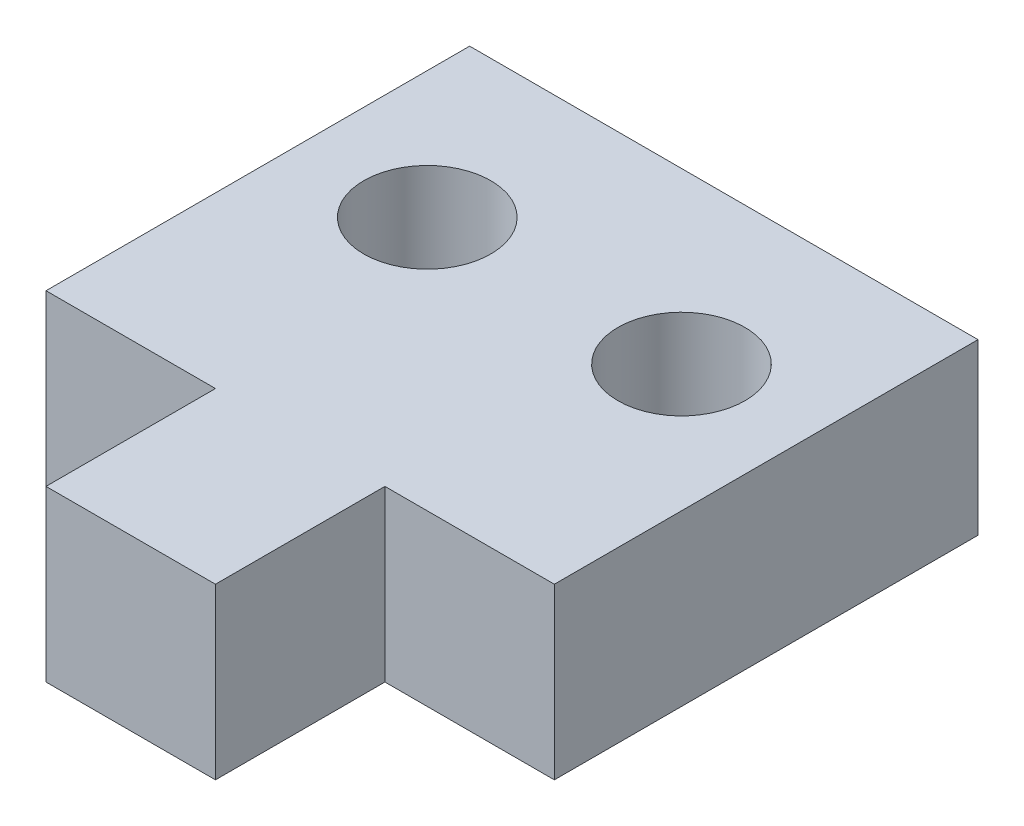
ISO-10303-21;
HEADER;
FILE_DESCRIPTION(('STEP AP214'),'2;1');
FILE_NAME('part.step','',(''),(''),'','','');
FILE_SCHEMA(('AUTOMOTIVE_DESIGN { 1 0 10303 214 1 1 1 1 }'));
ENDSEC;
DATA;
#1=APPLICATION_CONTEXT('core data for automotive mechanical design processes');
#2=APPLICATION_PROTOCOL_DEFINITION('international standard','automotive_design',2000,#1);
#3=PRODUCT_CONTEXT('',#1,'mechanical');
#4=PRODUCT('Part','Part','',(#3));
#5=PRODUCT_RELATED_PRODUCT_CATEGORY('part','',(#4));
#6=PRODUCT_DEFINITION_FORMATION('','',#4);
#7=PRODUCT_DEFINITION_CONTEXT('part definition',#1,'design');
#8=PRODUCT_DEFINITION('design','',#6,#7);
#9=PRODUCT_DEFINITION_SHAPE('','',#8);
#10=(LENGTH_UNIT() NAMED_UNIT(*) SI_UNIT(.MILLI.,.METRE.));
#11=(NAMED_UNIT(*) PLANE_ANGLE_UNIT() SI_UNIT($,.RADIAN.));
#12=(NAMED_UNIT(*) SI_UNIT($,.STERADIAN.) SOLID_ANGLE_UNIT());
#13=UNCERTAINTY_MEASURE_WITH_UNIT(LENGTH_MEASURE(1.E-05),#10,'distance_accuracy_value','');
#14=(GEOMETRIC_REPRESENTATION_CONTEXT(3) GLOBAL_UNCERTAINTY_ASSIGNED_CONTEXT((#13)) GLOBAL_UNIT_ASSIGNED_CONTEXT((#10,
#11,#12)) REPRESENTATION_CONTEXT('',''));
#15=CARTESIAN_POINT('',(0.,0.,0.));
#16=DIRECTION('',(0.,0.,1.));
#17=DIRECTION('',(1.,0.,0.));
#18=AXIS2_PLACEMENT_3D('',#15,#16,#17);
#19=CARTESIAN_POINT('',(6.,4.,0.));
#20=DIRECTION('',(1.,0.,0.));
#21=DIRECTION('',(0.,0.,-1.));
#22=AXIS2_PLACEMENT_3D('',#19,#20,#21);
#23=PLANE('',#22);
#24=DIRECTION('',(0.,0.,1.));
#25=VECTOR('',#24,1.);
#26=CARTESIAN_POINT('',(6.,0.,0.));
#27=LINE('',#26,#25);
#28=CARTESIAN_POINT('',(6.,0.,-5.));
#29=VERTEX_POINT('',#28);
#30=CARTESIAN_POINT('',(6.,0.,5.));
#31=VERTEX_POINT('',#30);
#32=EDGE_CURVE('E130',#29,#31,#27,.T.);
#33=ORIENTED_EDGE('',*,*,#32,.F.);
#34=DIRECTION('',(0.,-1.,0.));
#35=VECTOR('',#34,1.);
#36=CARTESIAN_POINT('',(6.,4.,-5.));
#37=LINE('',#36,#35);
#38=CARTESIAN_POINT('',(6.,4.,-5.));
#39=VERTEX_POINT('',#38);
#40=EDGE_CURVE('E11',#39,#29,#37,.T.);
#41=ORIENTED_EDGE('',*,*,#40,.F.);
#42=DIRECTION('',(0.,0.,1.));
#43=VECTOR('',#42,1.);
#44=CARTESIAN_POINT('',(6.,4.,0.));
#45=LINE('',#44,#43);
#46=CARTESIAN_POINT('',(6.,4.,5.));
#47=VERTEX_POINT('',#46);
#48=EDGE_CURVE('E172',#39,#47,#45,.T.);
#49=ORIENTED_EDGE('',*,*,#48,.T.);
#50=DIRECTION('',(0.,-1.,0.));
#51=VECTOR('',#50,1.);
#52=CARTESIAN_POINT('',(6.,4.,5.));
#53=LINE('',#52,#51);
#54=EDGE_CURVE('E88',#47,#31,#53,.T.);
#55=ORIENTED_EDGE('',*,*,#54,.T.);
#56=EDGE_LOOP('',(#33,#41,#49,#55));
#57=FACE_BOUND('',#56,.T.);
#58=ADVANCED_FACE('F37',(#57),#23,.T.);
#59=CARTESIAN_POINT('',(0.,4.,-5.));
#60=DIRECTION('',(0.,0.,-1.));
#61=DIRECTION('',(-1.,0.,0.));
#62=AXIS2_PLACEMENT_3D('',#59,#60,#61);
#63=PLANE('',#62);
#64=DIRECTION('',(1.,0.,0.));
#65=VECTOR('',#64,1.);
#66=CARTESIAN_POINT('',(0.,0.,-5.));
#67=LINE('',#66,#65);
#68=CARTESIAN_POINT('',(-6.,0.,-5.));
#69=VERTEX_POINT('',#68);
#70=EDGE_CURVE('E133',#69,#29,#67,.T.);
#71=ORIENTED_EDGE('',*,*,#70,.F.);
#72=DIRECTION('',(0.,-1.,0.));
#73=VECTOR('',#72,1.);
#74=CARTESIAN_POINT('',(-6.,4.,-5.));
#75=LINE('',#74,#73);
#76=CARTESIAN_POINT('',(-6.,4.,-5.));
#77=VERTEX_POINT('',#76);
#78=EDGE_CURVE('E45',#77,#69,#75,.T.);
#79=ORIENTED_EDGE('',*,*,#78,.F.);
#80=DIRECTION('',(1.,0.,0.));
#81=VECTOR('',#80,1.);
#82=CARTESIAN_POINT('',(0.,4.,-5.));
#83=LINE('',#82,#81);
#84=EDGE_CURVE('E169',#77,#39,#83,.T.);
#85=ORIENTED_EDGE('',*,*,#84,.T.);
#86=ORIENTED_EDGE('',*,*,#40,.T.);
#87=EDGE_LOOP('',(#71,#79,#85,#86));
#88=FACE_BOUND('',#87,.T.);
#89=ADVANCED_FACE('F168',(#88),#63,.T.);
#90=CARTESIAN_POINT('',(-6.,4.,0.));
#91=DIRECTION('',(1.,0.,0.));
#92=DIRECTION('',(0.,0.,-1.));
#93=AXIS2_PLACEMENT_3D('',#90,#91,#92);
#94=PLANE('',#93);
#95=DIRECTION('',(0.,0.,1.));
#96=VECTOR('',#95,1.);
#97=CARTESIAN_POINT('',(-6.,0.,0.));
#98=LINE('',#97,#96);
#99=CARTESIAN_POINT('',(-6.,0.,5.));
#100=VERTEX_POINT('',#99);
#101=EDGE_CURVE('E137',#69,#100,#98,.T.);
#102=ORIENTED_EDGE('',*,*,#101,.T.);
#103=DIRECTION('',(0.,-1.,0.));
#104=VECTOR('',#103,1.);
#105=CARTESIAN_POINT('',(-6.,4.,5.));
#106=LINE('',#105,#104);
#107=CARTESIAN_POINT('',(-6.,4.,5.));
#108=VERTEX_POINT('',#107);
#109=EDGE_CURVE('E152',#108,#100,#106,.T.);
#110=ORIENTED_EDGE('',*,*,#109,.F.);
#111=DIRECTION('',(0.,0.,1.));
#112=VECTOR('',#111,1.);
#113=CARTESIAN_POINT('',(-6.,4.,0.));
#114=LINE('',#113,#112);
#115=EDGE_CURVE('E159',#77,#108,#114,.T.);
#116=ORIENTED_EDGE('',*,*,#115,.F.);
#117=ORIENTED_EDGE('',*,*,#78,.T.);
#118=EDGE_LOOP('',(#102,#110,#116,#117));
#119=FACE_BOUND('',#118,.T.);
#120=ADVANCED_FACE('F157',(#119),#94,.F.);
#121=CARTESIAN_POINT('',(0.,4.,5.));
#122=DIRECTION('',(0.,0.,-1.));
#123=DIRECTION('',(-1.,0.,0.));
#124=AXIS2_PLACEMENT_3D('',#121,#122,#123);
#125=PLANE('',#124);
#126=DIRECTION('',(1.,0.,0.));
#127=VECTOR('',#126,1.);
#128=CARTESIAN_POINT('',(0.,0.,5.));
#129=LINE('',#128,#127);
#130=CARTESIAN_POINT('',(-2.,0.,5.));
#131=VERTEX_POINT('',#130);
#132=EDGE_CURVE('E139',#100,#131,#129,.T.);
#133=ORIENTED_EDGE('',*,*,#132,.T.);
#134=DIRECTION('',(0.,-1.,0.));
#135=VECTOR('',#134,1.);
#136=CARTESIAN_POINT('',(-2.,4.,5.));
#137=LINE('',#136,#135);
#138=CARTESIAN_POINT('',(-2.,4.,5.));
#139=VERTEX_POINT('',#138);
#140=EDGE_CURVE('E149',#139,#131,#137,.T.);
#141=ORIENTED_EDGE('',*,*,#140,.F.);
#142=DIRECTION('',(1.,0.,0.));
#143=VECTOR('',#142,1.);
#144=CARTESIAN_POINT('',(0.,4.,5.));
#145=LINE('',#144,#143);
#146=EDGE_CURVE('E127',#108,#139,#145,.T.);
#147=ORIENTED_EDGE('',*,*,#146,.F.);
#148=ORIENTED_EDGE('',*,*,#109,.T.);
#149=EDGE_LOOP('',(#133,#141,#147,#148));
#150=FACE_BOUND('',#149,.T.);
#151=ADVANCED_FACE('F182',(#150),#125,.F.);
#152=CARTESIAN_POINT('',(-2.,4.,0.));
#153=DIRECTION('',(1.,0.,0.));
#154=DIRECTION('',(0.,0.,-1.));
#155=AXIS2_PLACEMENT_3D('',#152,#153,#154);
#156=PLANE('',#155);
#157=DIRECTION('',(0.,0.,1.));
#158=VECTOR('',#157,1.);
#159=CARTESIAN_POINT('',(-2.,0.,0.));
#160=LINE('',#159,#158);
#161=CARTESIAN_POINT('',(-2.,0.,9.));
#162=VERTEX_POINT('',#161);
#163=EDGE_CURVE('E141',#131,#162,#160,.T.);
#164=ORIENTED_EDGE('',*,*,#163,.T.);
#165=DIRECTION('',(0.,-1.,0.));
#166=VECTOR('',#165,1.);
#167=CARTESIAN_POINT('',(-2.,4.,9.));
#168=LINE('',#167,#166);
#169=CARTESIAN_POINT('',(-2.,4.,9.));
#170=VERTEX_POINT('',#169);
#171=EDGE_CURVE('E121',#170,#162,#168,.T.);
#172=ORIENTED_EDGE('',*,*,#171,.F.);
#173=DIRECTION('',(0.,0.,1.));
#174=VECTOR('',#173,1.);
#175=CARTESIAN_POINT('',(-2.,4.,0.));
#176=LINE('',#175,#174);
#177=EDGE_CURVE('E112',#139,#170,#176,.T.);
#178=ORIENTED_EDGE('',*,*,#177,.F.);
#179=ORIENTED_EDGE('',*,*,#140,.T.);
#180=EDGE_LOOP('',(#164,#172,#178,#179));
#181=FACE_BOUND('',#180,.T.);
#182=ADVANCED_FACE('F184',(#181),#156,.F.);
#183=CARTESIAN_POINT('',(0.,4.,9.));
#184=DIRECTION('',(0.,0.,-1.));
#185=DIRECTION('',(-1.,0.,0.));
#186=AXIS2_PLACEMENT_3D('',#183,#184,#185);
#187=PLANE('',#186);
#188=DIRECTION('',(1.,0.,0.));
#189=VECTOR('',#188,1.);
#190=CARTESIAN_POINT('',(0.,0.,9.));
#191=LINE('',#190,#189);
#192=CARTESIAN_POINT('',(2.,0.,9.));
#193=VERTEX_POINT('',#192);
#194=EDGE_CURVE('E120',#162,#193,#191,.T.);
#195=ORIENTED_EDGE('',*,*,#194,.T.);
#196=DIRECTION('',(0.,-1.,0.));
#197=VECTOR('',#196,1.);
#198=CARTESIAN_POINT('',(2.,4.,9.));
#199=LINE('',#198,#197);
#200=CARTESIAN_POINT('',(2.,4.,9.));
#201=VERTEX_POINT('',#200);
#202=EDGE_CURVE('E117',#201,#193,#199,.T.);
#203=ORIENTED_EDGE('',*,*,#202,.F.);
#204=DIRECTION('',(1.,0.,0.));
#205=VECTOR('',#204,1.);
#206=CARTESIAN_POINT('',(0.,4.,9.));
#207=LINE('',#206,#205);
#208=EDGE_CURVE('E106',#170,#201,#207,.T.);
#209=ORIENTED_EDGE('',*,*,#208,.F.);
#210=ORIENTED_EDGE('',*,*,#171,.T.);
#211=EDGE_LOOP('',(#195,#203,#209,#210));
#212=FACE_BOUND('',#211,.T.);
#213=ADVANCED_FACE('F118',(#212),#187,.F.);
#214=CARTESIAN_POINT('',(2.00000000000001,4.,0.));
#215=DIRECTION('',(-1.,0.,0.));
#216=DIRECTION('',(0.,0.,1.));
#217=AXIS2_PLACEMENT_3D('',#214,#215,#216);
#218=PLANE('',#217);
#219=DIRECTION('',(0.,0.,-1.));
#220=VECTOR('',#219,1.);
#221=CARTESIAN_POINT('',(2.00000000000001,0.,0.));
#222=LINE('',#221,#220);
#223=CARTESIAN_POINT('',(2.,0.,5.));
#224=VERTEX_POINT('',#223);
#225=EDGE_CURVE('E81',#193,#224,#222,.T.);
#226=ORIENTED_EDGE('',*,*,#225,.T.);
#227=DIRECTION('',(0.,-1.,0.));
#228=VECTOR('',#227,1.);
#229=CARTESIAN_POINT('',(2.,4.,5.));
#230=LINE('',#229,#228);
#231=CARTESIAN_POINT('',(2.,4.,5.));
#232=VERTEX_POINT('',#231);
#233=EDGE_CURVE('E122',#232,#224,#230,.T.);
#234=ORIENTED_EDGE('',*,*,#233,.F.);
#235=DIRECTION('',(0.,0.,-1.));
#236=VECTOR('',#235,1.);
#237=CARTESIAN_POINT('',(2.00000000000001,4.,0.));
#238=LINE('',#237,#236);
#239=EDGE_CURVE('E110',#201,#232,#238,.T.);
#240=ORIENTED_EDGE('',*,*,#239,.F.);
#241=ORIENTED_EDGE('',*,*,#202,.T.);
#242=EDGE_LOOP('',(#226,#234,#240,#241));
#243=FACE_BOUND('',#242,.T.);
#244=ADVANCED_FACE('F124',(#243),#218,.F.);
#245=EDGE_CURVE('E142',#224,#31,#129,.T.);
#246=ORIENTED_EDGE('',*,*,#245,.T.);
#247=ORIENTED_EDGE('',*,*,#54,.F.);
#248=EDGE_CURVE('E53',#232,#47,#145,.T.);
#249=ORIENTED_EDGE('',*,*,#248,.F.);
#250=ORIENTED_EDGE('',*,*,#233,.T.);
#251=EDGE_LOOP('',(#246,#247,#249,#250));
#252=FACE_BOUND('',#251,.T.);
#253=ADVANCED_FACE('F193',(#252),#125,.F.);
#254=CARTESIAN_POINT('',(0.,4.,0.));
#255=DIRECTION('',(0.,1.,0.));
#256=DIRECTION('',(0.,0.,1.));
#257=AXIS2_PLACEMENT_3D('',#254,#255,#256);
#258=PLANE('',#257);
#259=CARTESIAN_POINT('',(-3.,4.,-1.));
#260=DIRECTION('',(0.,1.,0.));
#261=DIRECTION('',(0.,0.,1.));
#262=AXIS2_PLACEMENT_3D('',#259,#260,#261);
#263=CIRCLE('',#262,1.5);
#264=CARTESIAN_POINT('',(-3.,4.,0.499999999999999));
#265=VERTEX_POINT('',#264);
#266=EDGE_CURVE('E282',#265,#265,#263,.T.);
#267=ORIENTED_EDGE('',*,*,#266,.F.);
#268=EDGE_LOOP('',(#267));
#269=FACE_BOUND('',#268,.T.);
#270=CARTESIAN_POINT('',(3.,4.,-1.));
#271=DIRECTION('',(0.,1.,0.));
#272=DIRECTION('',(0.,0.,1.));
#273=AXIS2_PLACEMENT_3D('',#270,#271,#272);
#274=CIRCLE('',#273,1.5);
#275=CARTESIAN_POINT('',(3.,4.,0.5));
#276=VERTEX_POINT('',#275);
#277=EDGE_CURVE('E176',#276,#276,#274,.T.);
#278=ORIENTED_EDGE('',*,*,#277,.F.);
#279=EDGE_LOOP('',(#278));
#280=FACE_BOUND('',#279,.T.);
#281=ORIENTED_EDGE('',*,*,#48,.F.);
#282=ORIENTED_EDGE('',*,*,#84,.F.);
#283=ORIENTED_EDGE('',*,*,#115,.T.);
#284=ORIENTED_EDGE('',*,*,#146,.T.);
#285=ORIENTED_EDGE('',*,*,#177,.T.);
#286=ORIENTED_EDGE('',*,*,#208,.T.);
#287=ORIENTED_EDGE('',*,*,#239,.T.);
#288=ORIENTED_EDGE('',*,*,#248,.T.);
#289=EDGE_LOOP('',(#281,#282,#283,#284,#285,#286,#287,#288));
#290=FACE_BOUND('',#289,.T.);
#291=ADVANCED_FACE('F108',(#269,#280,#290),#258,.T.);
#292=CARTESIAN_POINT('',(0.,0.,0.));
#293=DIRECTION('',(0.,1.,0.));
#294=DIRECTION('',(0.,0.,1.));
#295=AXIS2_PLACEMENT_3D('',#292,#293,#294);
#296=PLANE('',#295);
#297=CARTESIAN_POINT('',(-3.,0.,-1.));
#298=DIRECTION('',(0.,1.,0.));
#299=DIRECTION('',(0.,0.,1.));
#300=AXIS2_PLACEMENT_3D('',#297,#298,#299);
#301=CIRCLE('',#300,1.5);
#302=CARTESIAN_POINT('',(-3.,0.,0.499999999999999));
#303=VERTEX_POINT('',#302);
#304=EDGE_CURVE('E134',#303,#303,#301,.T.);
#305=ORIENTED_EDGE('',*,*,#304,.T.);
#306=EDGE_LOOP('',(#305));
#307=FACE_BOUND('',#306,.T.);
#308=CARTESIAN_POINT('',(3.,0.,-1.));
#309=DIRECTION('',(0.,1.,0.));
#310=DIRECTION('',(0.,0.,1.));
#311=AXIS2_PLACEMENT_3D('',#308,#309,#310);
#312=CIRCLE('',#311,1.5);
#313=CARTESIAN_POINT('',(3.,0.,0.5));
#314=VERTEX_POINT('',#313);
#315=EDGE_CURVE('E283',#314,#314,#312,.T.);
#316=ORIENTED_EDGE('',*,*,#315,.T.);
#317=EDGE_LOOP('',(#316));
#318=FACE_BOUND('',#317,.T.);
#319=ORIENTED_EDGE('',*,*,#32,.T.);
#320=ORIENTED_EDGE('',*,*,#245,.F.);
#321=ORIENTED_EDGE('',*,*,#225,.F.);
#322=ORIENTED_EDGE('',*,*,#194,.F.);
#323=ORIENTED_EDGE('',*,*,#163,.F.);
#324=ORIENTED_EDGE('',*,*,#132,.F.);
#325=ORIENTED_EDGE('',*,*,#101,.F.);
#326=ORIENTED_EDGE('',*,*,#70,.T.);
#327=EDGE_LOOP('',(#319,#320,#321,#322,#323,#324,#325,#326));
#328=FACE_BOUND('',#327,.T.);
#329=ADVANCED_FACE('F166',(#307,#318,#328),#296,.F.);
#330=CARTESIAN_POINT('',(3.,0.,-1.));
#331=DIRECTION('',(0.,1.,0.));
#332=DIRECTION('',(0.,0.,1.));
#333=AXIS2_PLACEMENT_3D('',#330,#331,#332);
#334=CYLINDRICAL_SURFACE('',#333,1.5);
#335=ORIENTED_EDGE('',*,*,#315,.F.);
#336=EDGE_LOOP('',(#335));
#337=FACE_BOUND('',#336,.T.);
#338=ORIENTED_EDGE('',*,*,#277,.T.);
#339=EDGE_LOOP('',(#338));
#340=FACE_BOUND('',#339,.T.);
#341=ADVANCED_FACE('F253',(#337,#340),#334,.F.);
#342=CARTESIAN_POINT('',(-3.,0.,-1.));
#343=DIRECTION('',(0.,1.,0.));
#344=DIRECTION('',(0.,0.,1.));
#345=AXIS2_PLACEMENT_3D('',#342,#343,#344);
#346=CYLINDRICAL_SURFACE('',#345,1.5);
#347=ORIENTED_EDGE('',*,*,#304,.F.);
#348=EDGE_LOOP('',(#347));
#349=FACE_BOUND('',#348,.T.);
#350=ORIENTED_EDGE('',*,*,#266,.T.);
#351=EDGE_LOOP('',(#350));
#352=FACE_BOUND('',#351,.T.);
#353=ADVANCED_FACE('F263',(#349,#352),#346,.F.);
#354=CLOSED_SHELL('',(#58,#89,#120,#151,#182,#213,#244,#253,#291,#329,#341,#353));
#355=MANIFOLD_SOLID_BREP('B2',#354);
#356=ADVANCED_BREP_SHAPE_REPRESENTATION('',(#18,#355),#14);
#357=SHAPE_DEFINITION_REPRESENTATION(#9,#356);
ENDSEC;
END-ISO-10303-21;
